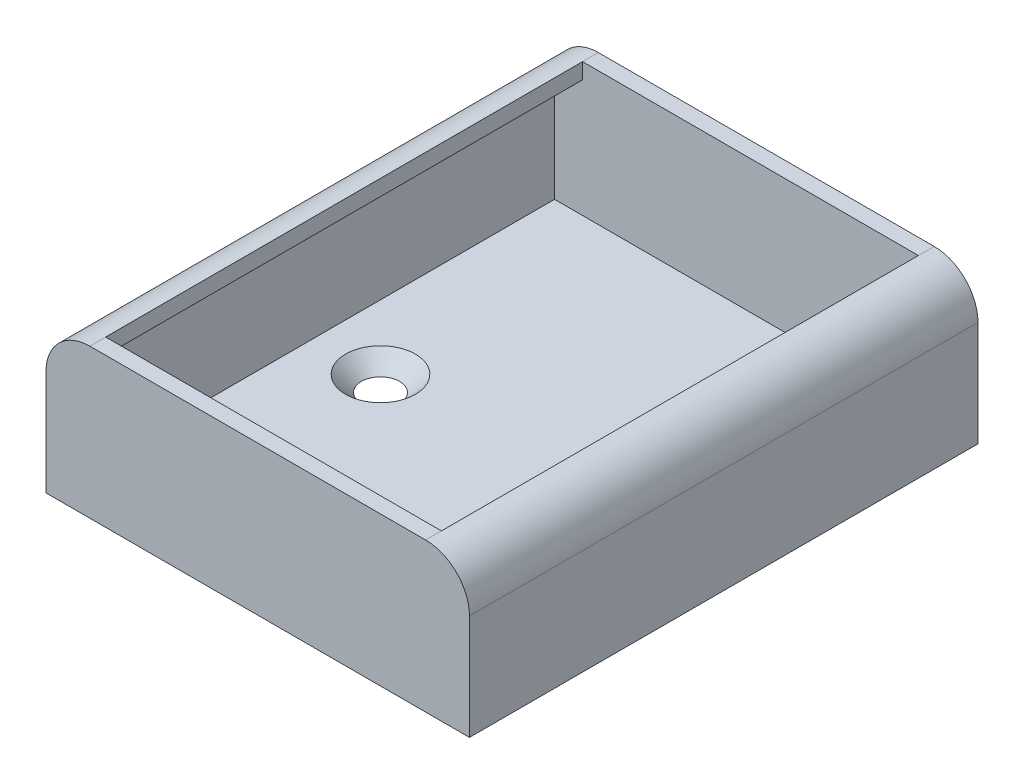
ISO-10303-21;
HEADER;
FILE_DESCRIPTION(('STEP AP214'),'2;1');
FILE_NAME('part.step','',(''),(''),'','','');
FILE_SCHEMA(('AUTOMOTIVE_DESIGN { 1 0 10303 214 1 1 1 1 }'));
ENDSEC;
DATA;
#1=APPLICATION_CONTEXT('core data for automotive mechanical design processes');
#2=APPLICATION_PROTOCOL_DEFINITION('international standard','automotive_design',2000,#1);
#3=PRODUCT_CONTEXT('',#1,'mechanical');
#4=PRODUCT('Part','Part','',(#3));
#5=PRODUCT_RELATED_PRODUCT_CATEGORY('part','',(#4));
#6=PRODUCT_DEFINITION_FORMATION('','',#4);
#7=PRODUCT_DEFINITION_CONTEXT('part definition',#1,'design');
#8=PRODUCT_DEFINITION('design','',#6,#7);
#9=PRODUCT_DEFINITION_SHAPE('','',#8);
#10=(LENGTH_UNIT() NAMED_UNIT(*) SI_UNIT(.MILLI.,.METRE.));
#11=(NAMED_UNIT(*) PLANE_ANGLE_UNIT() SI_UNIT($,.RADIAN.));
#12=(NAMED_UNIT(*) SI_UNIT($,.STERADIAN.) SOLID_ANGLE_UNIT());
#13=UNCERTAINTY_MEASURE_WITH_UNIT(LENGTH_MEASURE(1.E-05),#10,'distance_accuracy_value','');
#14=(GEOMETRIC_REPRESENTATION_CONTEXT(3) GLOBAL_UNCERTAINTY_ASSIGNED_CONTEXT((#13)) GLOBAL_UNIT_ASSIGNED_CONTEXT((#10,
#11,#12)) REPRESENTATION_CONTEXT('',''));
#15=CARTESIAN_POINT('',(0.,0.,0.));
#16=DIRECTION('',(0.,0.,1.));
#17=DIRECTION('',(1.,0.,0.));
#18=AXIS2_PLACEMENT_3D('',#15,#16,#17);
#19=CARTESIAN_POINT('',(0.,17.,0.));
#20=DIRECTION('',(0.,-1.,0.));
#21=DIRECTION('',(0.,0.,-1.));
#22=AXIS2_PLACEMENT_3D('',#19,#20,#21);
#23=PLANE('',#22);
#24=DIRECTION('',(-1.,0.,0.));
#25=VECTOR('',#24,1.);
#26=CARTESIAN_POINT('',(0.,17.,-27.2));
#27=LINE('',#26,#25);
#28=CARTESIAN_POINT('',(19.15,17.,-27.2));
#29=VERTEX_POINT('',#28);
#30=CARTESIAN_POINT('',(-19.15,17.,-27.2));
#31=VERTEX_POINT('',#30);
#32=EDGE_CURVE('E191',#29,#31,#27,.T.);
#33=ORIENTED_EDGE('',*,*,#32,.F.);
#34=DIRECTION('',(0.,0.,-1.));
#35=VECTOR('',#34,1.);
#36=CARTESIAN_POINT('',(19.15,17.,0.));
#37=LINE('',#36,#35);
#38=CARTESIAN_POINT('',(19.15,17.,-29.));
#39=VERTEX_POINT('',#38);
#40=EDGE_CURVE('E238',#29,#39,#37,.T.);
#41=ORIENTED_EDGE('',*,*,#40,.T.);
#42=DIRECTION('',(-1.,0.,0.));
#43=VECTOR('',#42,1.);
#44=CARTESIAN_POINT('',(-24.15,17.,-29.));
#45=LINE('',#44,#43);
#46=CARTESIAN_POINT('',(-19.15,17.,-29.));
#47=VERTEX_POINT('',#46);
#48=EDGE_CURVE('E214',#39,#47,#45,.T.);
#49=ORIENTED_EDGE('',*,*,#48,.T.);
#50=DIRECTION('',(0.,0.,1.));
#51=VECTOR('',#50,1.);
#52=CARTESIAN_POINT('',(-19.15,17.,0.));
#53=LINE('',#52,#51);
#54=EDGE_CURVE('E243',#47,#31,#53,.T.);
#55=ORIENTED_EDGE('',*,*,#54,.T.);
#56=EDGE_LOOP('',(#33,#41,#49,#55));
#57=FACE_BOUND('',#56,.T.);
#58=ADVANCED_FACE('F41',(#57),#23,.F.);
#59=DIRECTION('',(1.,0.,0.));
#60=VECTOR('',#59,1.);
#61=CARTESIAN_POINT('',(0.,17.,27.2));
#62=LINE('',#61,#60);
#63=CARTESIAN_POINT('',(-19.15,17.,27.2));
#64=VERTEX_POINT('',#63);
#65=CARTESIAN_POINT('',(19.15,17.,27.2));
#66=VERTEX_POINT('',#65);
#67=EDGE_CURVE('E204',#64,#66,#62,.T.);
#68=ORIENTED_EDGE('',*,*,#67,.F.);
#69=CARTESIAN_POINT('',(-19.15,17.,29.));
#70=VERTEX_POINT('',#69);
#71=EDGE_CURVE('E241',#64,#70,#53,.T.);
#72=ORIENTED_EDGE('',*,*,#71,.T.);
#73=DIRECTION('',(1.,0.,0.));
#74=VECTOR('',#73,1.);
#75=CARTESIAN_POINT('',(-24.15,17.,29.));
#76=LINE('',#75,#74);
#77=CARTESIAN_POINT('',(19.15,17.,29.));
#78=VERTEX_POINT('',#77);
#79=EDGE_CURVE('E217',#70,#78,#76,.T.);
#80=ORIENTED_EDGE('',*,*,#79,.T.);
#81=EDGE_CURVE('E242',#78,#66,#37,.T.);
#82=ORIENTED_EDGE('',*,*,#81,.T.);
#83=EDGE_LOOP('',(#68,#72,#80,#82));
#84=FACE_BOUND('',#83,.T.);
#85=ADVANCED_FACE('F308',(#84),#23,.F.);
#86=CARTESIAN_POINT('',(24.15,17.,29.));
#87=DIRECTION('',(-1.,0.,0.));
#88=DIRECTION('',(0.,0.,1.));
#89=AXIS2_PLACEMENT_3D('',#86,#87,#88);
#90=PLANE('',#89);
#91=DIRECTION('',(0.,-1.,0.));
#92=VECTOR('',#91,1.);
#93=CARTESIAN_POINT('',(24.15,17.,-29.));
#94=LINE('',#93,#92);
#95=CARTESIAN_POINT('',(24.15,12.,-29.));
#96=VERTEX_POINT('',#95);
#97=CARTESIAN_POINT('',(24.15,0.,-29.));
#98=VERTEX_POINT('',#97);
#99=EDGE_CURVE('E236',#96,#98,#94,.T.);
#100=ORIENTED_EDGE('',*,*,#99,.F.);
#101=DIRECTION('',(0.,0.,-1.));
#102=VECTOR('',#101,1.);
#103=CARTESIAN_POINT('',(24.15,12.,29.));
#104=LINE('',#103,#102);
#105=CARTESIAN_POINT('',(24.15,12.,29.));
#106=VERTEX_POINT('',#105);
#107=EDGE_CURVE('E260',#96,#106,#104,.F.);
#108=ORIENTED_EDGE('',*,*,#107,.T.);
#109=DIRECTION('',(0.,-1.,0.));
#110=VECTOR('',#109,1.);
#111=CARTESIAN_POINT('',(24.15,17.,29.));
#112=LINE('',#111,#110);
#113=CARTESIAN_POINT('',(24.15,0.,29.));
#114=VERTEX_POINT('',#113);
#115=EDGE_CURVE('E225',#106,#114,#112,.T.);
#116=ORIENTED_EDGE('',*,*,#115,.T.);
#117=DIRECTION('',(0.,0.,-1.));
#118=VECTOR('',#117,1.);
#119=CARTESIAN_POINT('',(24.15,0.,29.));
#120=LINE('',#119,#118);
#121=EDGE_CURVE('E210',#114,#98,#120,.T.);
#122=ORIENTED_EDGE('',*,*,#121,.T.);
#123=EDGE_LOOP('',(#100,#108,#116,#122));
#124=FACE_BOUND('',#123,.T.);
#125=ADVANCED_FACE('F283',(#124),#90,.F.);
#126=CARTESIAN_POINT('',(-24.15,17.,-29.));
#127=DIRECTION('',(0.,0.,1.));
#128=DIRECTION('',(1.,0.,0.));
#129=AXIS2_PLACEMENT_3D('',#126,#127,#128);
#130=PLANE('',#129);
#131=DIRECTION('',(0.,-1.,0.));
#132=VECTOR('',#131,1.);
#133=CARTESIAN_POINT('',(-24.15,17.,-29.));
#134=LINE('',#133,#132);
#135=CARTESIAN_POINT('',(-24.15,12.,-29.));
#136=VERTEX_POINT('',#135);
#137=CARTESIAN_POINT('',(-24.15,0.,-29.));
#138=VERTEX_POINT('',#137);
#139=EDGE_CURVE('E237',#136,#138,#134,.T.);
#140=ORIENTED_EDGE('',*,*,#139,.F.);
#141=CARTESIAN_POINT('',(-19.15,12.,-29.));
#142=DIRECTION('',(0.,0.,1.));
#143=DIRECTION('',(1.,0.,0.));
#144=AXIS2_PLACEMENT_3D('',#141,#142,#143);
#145=CIRCLE('',#144,5.);
#146=EDGE_CURVE('E254',#136,#47,#145,.F.);
#147=ORIENTED_EDGE('',*,*,#146,.T.);
#148=ORIENTED_EDGE('',*,*,#48,.F.);
#149=CARTESIAN_POINT('',(19.15,12.,-29.));
#150=DIRECTION('',(0.,0.,1.));
#151=DIRECTION('',(1.,0.,0.));
#152=AXIS2_PLACEMENT_3D('',#149,#150,#151);
#153=CIRCLE('',#152,5.);
#154=EDGE_CURVE('E63',#39,#96,#153,.F.);
#155=ORIENTED_EDGE('',*,*,#154,.T.);
#156=ORIENTED_EDGE('',*,*,#99,.T.);
#157=DIRECTION('',(-1.,0.,0.));
#158=VECTOR('',#157,1.);
#159=CARTESIAN_POINT('',(-24.15,0.,-29.));
#160=LINE('',#159,#158);
#161=EDGE_CURVE('E223',#98,#138,#160,.T.);
#162=ORIENTED_EDGE('',*,*,#161,.T.);
#163=EDGE_LOOP('',(#140,#147,#148,#155,#156,#162));
#164=FACE_BOUND('',#163,.T.);
#165=ADVANCED_FACE('F300',(#164),#130,.F.);
#166=CARTESIAN_POINT('',(-24.15,17.,29.));
#167=DIRECTION('',(1.,0.,0.));
#168=DIRECTION('',(0.,0.,-1.));
#169=AXIS2_PLACEMENT_3D('',#166,#167,#168);
#170=PLANE('',#169);
#171=DIRECTION('',(0.,-1.,0.));
#172=VECTOR('',#171,1.);
#173=CARTESIAN_POINT('',(-24.15,17.,29.));
#174=LINE('',#173,#172);
#175=CARTESIAN_POINT('',(-24.15,12.,29.));
#176=VERTEX_POINT('',#175);
#177=CARTESIAN_POINT('',(-24.15,0.,29.));
#178=VERTEX_POINT('',#177);
#179=EDGE_CURVE('E232',#176,#178,#174,.T.);
#180=ORIENTED_EDGE('',*,*,#179,.F.);
#181=DIRECTION('',(0.,0.,1.));
#182=VECTOR('',#181,1.);
#183=CARTESIAN_POINT('',(-24.15,12.,29.));
#184=LINE('',#183,#182);
#185=EDGE_CURVE('E252',#176,#136,#184,.F.);
#186=ORIENTED_EDGE('',*,*,#185,.T.);
#187=ORIENTED_EDGE('',*,*,#139,.T.);
#188=DIRECTION('',(0.,0.,1.));
#189=VECTOR('',#188,1.);
#190=CARTESIAN_POINT('',(-24.15,0.,29.));
#191=LINE('',#190,#189);
#192=EDGE_CURVE('E230',#138,#178,#191,.T.);
#193=ORIENTED_EDGE('',*,*,#192,.T.);
#194=EDGE_LOOP('',(#180,#186,#187,#193));
#195=FACE_BOUND('',#194,.T.);
#196=ADVANCED_FACE('F293',(#195),#170,.F.);
#197=CARTESIAN_POINT('',(-24.15,17.,29.));
#198=DIRECTION('',(0.,0.,-1.));
#199=DIRECTION('',(-1.,0.,0.));
#200=AXIS2_PLACEMENT_3D('',#197,#198,#199);
#201=PLANE('',#200);
#202=ORIENTED_EDGE('',*,*,#79,.F.);
#203=CARTESIAN_POINT('',(-19.15,12.,29.));
#204=DIRECTION('',(0.,0.,-1.));
#205=DIRECTION('',(-1.,0.,0.));
#206=AXIS2_PLACEMENT_3D('',#203,#204,#205);
#207=CIRCLE('',#206,5.);
#208=EDGE_CURVE('E249',#70,#176,#207,.F.);
#209=ORIENTED_EDGE('',*,*,#208,.T.);
#210=ORIENTED_EDGE('',*,*,#179,.T.);
#211=DIRECTION('',(1.,0.,0.));
#212=VECTOR('',#211,1.);
#213=CARTESIAN_POINT('',(-24.15,0.,29.));
#214=LINE('',#213,#212);
#215=EDGE_CURVE('E218',#178,#114,#214,.T.);
#216=ORIENTED_EDGE('',*,*,#215,.T.);
#217=ORIENTED_EDGE('',*,*,#115,.F.);
#218=CARTESIAN_POINT('',(19.15,12.,29.));
#219=DIRECTION('',(0.,0.,-1.));
#220=DIRECTION('',(-1.,0.,0.));
#221=AXIS2_PLACEMENT_3D('',#218,#219,#220);
#222=CIRCLE('',#221,5.);
#223=EDGE_CURVE('E248',#106,#78,#222,.F.);
#224=ORIENTED_EDGE('',*,*,#223,.T.);
#225=EDGE_LOOP('',(#202,#209,#210,#216,#217,#224));
#226=FACE_BOUND('',#225,.T.);
#227=ADVANCED_FACE('F280',(#226),#201,.F.);
#228=CARTESIAN_POINT('',(0.,0.,0.));
#229=DIRECTION('',(0.,-1.,0.));
#230=DIRECTION('',(0.,0.,-1.));
#231=AXIS2_PLACEMENT_3D('',#228,#229,#230);
#232=PLANE('',#231);
#233=CARTESIAN_POINT('',(-15.,0.,0.));
#234=DIRECTION('',(0.,-1.,0.));
#235=DIRECTION('',(0.,0.,-1.));
#236=AXIS2_PLACEMENT_3D('',#233,#234,#235);
#237=CIRCLE('',#236,2.18000000000003);
#238=CARTESIAN_POINT('',(-15.,0.,-2.18000000000003));
#239=VERTEX_POINT('',#238);
#240=EDGE_CURVE('E265',#239,#239,#237,.F.);
#241=ORIENTED_EDGE('',*,*,#240,.T.);
#242=EDGE_LOOP('',(#241));
#243=FACE_BOUND('',#242,.T.);
#244=CARTESIAN_POINT('',(15.,0.,0.));
#245=DIRECTION('',(0.,-1.,0.));
#246=DIRECTION('',(0.,0.,-1.));
#247=AXIS2_PLACEMENT_3D('',#244,#245,#246);
#248=CIRCLE('',#247,2.18000000000003);
#249=CARTESIAN_POINT('',(15.,0.,-2.18000000000003));
#250=VERTEX_POINT('',#249);
#251=EDGE_CURVE('E259',#250,#250,#248,.F.);
#252=ORIENTED_EDGE('',*,*,#251,.T.);
#253=EDGE_LOOP('',(#252));
#254=FACE_BOUND('',#253,.T.);
#255=ORIENTED_EDGE('',*,*,#121,.F.);
#256=ORIENTED_EDGE('',*,*,#215,.F.);
#257=ORIENTED_EDGE('',*,*,#192,.F.);
#258=ORIENTED_EDGE('',*,*,#161,.F.);
#259=EDGE_LOOP('',(#255,#256,#257,#258));
#260=FACE_BOUND('',#259,.T.);
#261=ADVANCED_FACE('F272',(#243,#254,#260),#232,.T.);
#262=CARTESIAN_POINT('',(-19.15,12.,0.));
#263=DIRECTION('',(0.,0.,1.));
#264=DIRECTION('',(1.,0.,0.));
#265=AXIS2_PLACEMENT_3D('',#262,#263,#264);
#266=CYLINDRICAL_SURFACE('',#265,5.);
#267=ORIENTED_EDGE('',*,*,#146,.F.);
#268=ORIENTED_EDGE('',*,*,#185,.F.);
#269=ORIENTED_EDGE('',*,*,#208,.F.);
#270=ORIENTED_EDGE('',*,*,#71,.F.);
#271=DIRECTION('',(0.,0.,1.));
#272=VECTOR('',#271,1.);
#273=CARTESIAN_POINT('',(-19.15,17.,0.));
#274=LINE('',#273,#272);
#275=EDGE_CURVE('E192',#31,#64,#274,.T.);
#276=ORIENTED_EDGE('',*,*,#275,.F.);
#277=ORIENTED_EDGE('',*,*,#54,.F.);
#278=EDGE_LOOP('',(#267,#268,#269,#270,#276,#277));
#279=FACE_BOUND('',#278,.T.);
#280=ADVANCED_FACE('F277',(#279),#266,.T.);
#281=CARTESIAN_POINT('',(19.15,12.,0.));
#282=DIRECTION('',(0.,0.,-1.));
#283=DIRECTION('',(-1.,0.,0.));
#284=AXIS2_PLACEMENT_3D('',#281,#282,#283);
#285=CYLINDRICAL_SURFACE('',#284,5.);
#286=ORIENTED_EDGE('',*,*,#223,.F.);
#287=ORIENTED_EDGE('',*,*,#107,.F.);
#288=ORIENTED_EDGE('',*,*,#154,.F.);
#289=ORIENTED_EDGE('',*,*,#40,.F.);
#290=DIRECTION('',(0.,0.,-1.));
#291=VECTOR('',#290,1.);
#292=CARTESIAN_POINT('',(19.15,17.,0.));
#293=LINE('',#292,#291);
#294=EDGE_CURVE('E152',#66,#29,#293,.T.);
#295=ORIENTED_EDGE('',*,*,#294,.F.);
#296=ORIENTED_EDGE('',*,*,#81,.F.);
#297=EDGE_LOOP('',(#286,#287,#288,#289,#295,#296));
#298=FACE_BOUND('',#297,.T.);
#299=ADVANCED_FACE('F355',(#298),#285,.T.);
#300=CARTESIAN_POINT('',(19.15,17.,0.));
#301=DIRECTION('',(-1.,0.,0.));
#302=DIRECTION('',(0.,0.,-1.));
#303=AXIS2_PLACEMENT_3D('',#300,#301,#302);
#304=PLANE('',#303);
#305=ORIENTED_EDGE('',*,*,#294,.T.);
#306=DIRECTION('',(0.,1.,0.));
#307=VECTOR('',#306,1.);
#308=CARTESIAN_POINT('',(19.15,17.,-27.2));
#309=LINE('',#308,#307);
#310=CARTESIAN_POINT('',(19.15,15.2,-27.2));
#311=VERTEX_POINT('',#310);
#312=EDGE_CURVE('E196',#311,#29,#309,.T.);
#313=ORIENTED_EDGE('',*,*,#312,.F.);
#314=DIRECTION('',(0.,0.,-1.));
#315=VECTOR('',#314,1.);
#316=CARTESIAN_POINT('',(19.15,15.2,0.));
#317=LINE('',#316,#315);
#318=CARTESIAN_POINT('',(19.15,15.2,27.2));
#319=VERTEX_POINT('',#318);
#320=EDGE_CURVE('E201',#319,#311,#317,.T.);
#321=ORIENTED_EDGE('',*,*,#320,.F.);
#322=DIRECTION('',(0.,-1.,0.));
#323=VECTOR('',#322,1.);
#324=CARTESIAN_POINT('',(19.15,17.,27.2));
#325=LINE('',#324,#323);
#326=EDGE_CURVE('E60',#319,#66,#325,.F.);
#327=ORIENTED_EDGE('',*,*,#326,.T.);
#328=EDGE_LOOP('',(#305,#313,#321,#327));
#329=FACE_BOUND('',#328,.T.);
#330=ADVANCED_FACE('F362',(#329),#304,.T.);
#331=CARTESIAN_POINT('',(-19.15,17.,0.));
#332=DIRECTION('',(1.,0.,0.));
#333=DIRECTION('',(0.,0.,1.));
#334=AXIS2_PLACEMENT_3D('',#331,#332,#333);
#335=PLANE('',#334);
#336=ORIENTED_EDGE('',*,*,#275,.T.);
#337=DIRECTION('',(0.,1.,0.));
#338=VECTOR('',#337,1.);
#339=CARTESIAN_POINT('',(-19.15,17.,27.2));
#340=LINE('',#339,#338);
#341=CARTESIAN_POINT('',(-19.15,15.2,27.2));
#342=VERTEX_POINT('',#341);
#343=EDGE_CURVE('E200',#342,#64,#340,.T.);
#344=ORIENTED_EDGE('',*,*,#343,.F.);
#345=DIRECTION('',(0.,0.,1.));
#346=VECTOR('',#345,1.);
#347=CARTESIAN_POINT('',(-19.15,15.2,0.));
#348=LINE('',#347,#346);
#349=CARTESIAN_POINT('',(-19.15,15.2,-27.2));
#350=VERTEX_POINT('',#349);
#351=EDGE_CURVE('E199',#350,#342,#348,.T.);
#352=ORIENTED_EDGE('',*,*,#351,.F.);
#353=DIRECTION('',(0.,-1.,0.));
#354=VECTOR('',#353,1.);
#355=CARTESIAN_POINT('',(-19.15,17.,-27.2));
#356=LINE('',#355,#354);
#357=EDGE_CURVE('E194',#350,#31,#356,.F.);
#358=ORIENTED_EDGE('',*,*,#357,.T.);
#359=EDGE_LOOP('',(#336,#344,#352,#358));
#360=FACE_BOUND('',#359,.T.);
#361=ADVANCED_FACE('F381',(#360),#335,.T.);
#362=CARTESIAN_POINT('',(22.35,17.,29.));
#363=DIRECTION('',(-1.,0.,0.));
#364=DIRECTION('',(0.,0.,1.));
#365=AXIS2_PLACEMENT_3D('',#362,#363,#364);
#366=PLANE('',#365);
#367=DIRECTION('',(0.,-1.,0.));
#368=VECTOR('',#367,1.);
#369=CARTESIAN_POINT('',(22.35,17.,-27.2));
#370=LINE('',#369,#368);
#371=CARTESIAN_POINT('',(22.35,12.,-27.2));
#372=VERTEX_POINT('',#371);
#373=CARTESIAN_POINT('',(22.35,1.8,-27.2));
#374=VERTEX_POINT('',#373);
#375=EDGE_CURVE('E144',#372,#374,#370,.T.);
#376=ORIENTED_EDGE('',*,*,#375,.T.);
#377=DIRECTION('',(0.,0.,-1.));
#378=VECTOR('',#377,1.);
#379=CARTESIAN_POINT('',(22.35,1.8,0.));
#380=LINE('',#379,#378);
#381=CARTESIAN_POINT('',(22.35,1.8,27.2));
#382=VERTEX_POINT('',#381);
#383=EDGE_CURVE('E147',#382,#374,#380,.T.);
#384=ORIENTED_EDGE('',*,*,#383,.F.);
#385=DIRECTION('',(0.,-1.,0.));
#386=VECTOR('',#385,1.);
#387=CARTESIAN_POINT('',(22.35,17.,27.2));
#388=LINE('',#387,#386);
#389=CARTESIAN_POINT('',(22.35,12.,27.2));
#390=VERTEX_POINT('',#389);
#391=EDGE_CURVE('E171',#390,#382,#388,.T.);
#392=ORIENTED_EDGE('',*,*,#391,.F.);
#393=DIRECTION('',(0.,0.,1.));
#394=VECTOR('',#393,1.);
#395=CARTESIAN_POINT('',(22.35,12.,29.));
#396=LINE('',#395,#394);
#397=EDGE_CURVE('E151',#372,#390,#396,.T.);
#398=ORIENTED_EDGE('',*,*,#397,.F.);
#399=EDGE_LOOP('',(#376,#384,#392,#398));
#400=FACE_BOUND('',#399,.T.);
#401=ADVANCED_FACE('F150',(#400),#366,.T.);
#402=CARTESIAN_POINT('',(-24.15,17.,-27.2));
#403=DIRECTION('',(0.,0.,1.));
#404=DIRECTION('',(1.,0.,0.));
#405=AXIS2_PLACEMENT_3D('',#402,#403,#404);
#406=PLANE('',#405);
#407=DIRECTION('',(0.,-1.,0.));
#408=VECTOR('',#407,1.);
#409=CARTESIAN_POINT('',(-22.35,17.,-27.2));
#410=LINE('',#409,#408);
#411=CARTESIAN_POINT('',(-22.35,12.,-27.2));
#412=VERTEX_POINT('',#411);
#413=CARTESIAN_POINT('',(-22.35,1.8,-27.2));
#414=VERTEX_POINT('',#413);
#415=EDGE_CURVE('E154',#412,#414,#410,.T.);
#416=ORIENTED_EDGE('',*,*,#415,.T.);
#417=DIRECTION('',(-1.,0.,0.));
#418=VECTOR('',#417,1.);
#419=CARTESIAN_POINT('',(0.,1.8,-27.2));
#420=LINE('',#419,#418);
#421=EDGE_CURVE('E158',#374,#414,#420,.T.);
#422=ORIENTED_EDGE('',*,*,#421,.F.);
#423=ORIENTED_EDGE('',*,*,#375,.F.);
#424=CARTESIAN_POINT('',(19.15,12.,-27.2));
#425=DIRECTION('',(0.,0.,1.));
#426=DIRECTION('',(1.,0.,0.));
#427=AXIS2_PLACEMENT_3D('',#424,#425,#426);
#428=CIRCLE('',#427,3.2);
#429=EDGE_CURVE('E182',#311,#372,#428,.F.);
#430=ORIENTED_EDGE('',*,*,#429,.F.);
#431=ORIENTED_EDGE('',*,*,#312,.T.);
#432=ORIENTED_EDGE('',*,*,#32,.T.);
#433=ORIENTED_EDGE('',*,*,#357,.F.);
#434=CARTESIAN_POINT('',(-19.15,12.,-27.2));
#435=DIRECTION('',(0.,0.,1.));
#436=DIRECTION('',(1.,0.,0.));
#437=AXIS2_PLACEMENT_3D('',#434,#435,#436);
#438=CIRCLE('',#437,3.2);
#439=EDGE_CURVE('E178',#412,#350,#438,.F.);
#440=ORIENTED_EDGE('',*,*,#439,.F.);
#441=EDGE_LOOP('',(#416,#422,#423,#430,#431,#432,#433,#440));
#442=FACE_BOUND('',#441,.T.);
#443=ADVANCED_FACE('F157',(#442),#406,.T.);
#444=CARTESIAN_POINT('',(-22.35,17.,29.));
#445=DIRECTION('',(1.,0.,0.));
#446=DIRECTION('',(0.,0.,-1.));
#447=AXIS2_PLACEMENT_3D('',#444,#445,#446);
#448=PLANE('',#447);
#449=DIRECTION('',(0.,-1.,0.));
#450=VECTOR('',#449,1.);
#451=CARTESIAN_POINT('',(-22.35,17.,27.2));
#452=LINE('',#451,#450);
#453=CARTESIAN_POINT('',(-22.35,12.,27.2));
#454=VERTEX_POINT('',#453);
#455=CARTESIAN_POINT('',(-22.35,1.8,27.2));
#456=VERTEX_POINT('',#455);
#457=EDGE_CURVE('E180',#454,#456,#452,.T.);
#458=ORIENTED_EDGE('',*,*,#457,.T.);
#459=DIRECTION('',(0.,0.,1.));
#460=VECTOR('',#459,1.);
#461=CARTESIAN_POINT('',(-22.35,1.8,0.));
#462=LINE('',#461,#460);
#463=EDGE_CURVE('E164',#414,#456,#462,.T.);
#464=ORIENTED_EDGE('',*,*,#463,.F.);
#465=ORIENTED_EDGE('',*,*,#415,.F.);
#466=DIRECTION('',(0.,0.,-1.));
#467=VECTOR('',#466,1.);
#468=CARTESIAN_POINT('',(-22.35,12.,29.));
#469=LINE('',#468,#467);
#470=EDGE_CURVE('E185',#454,#412,#469,.T.);
#471=ORIENTED_EDGE('',*,*,#470,.F.);
#472=EDGE_LOOP('',(#458,#464,#465,#471));
#473=FACE_BOUND('',#472,.T.);
#474=ADVANCED_FACE('F386',(#473),#448,.T.);
#475=CARTESIAN_POINT('',(-24.15,17.,27.2));
#476=DIRECTION('',(0.,0.,-1.));
#477=DIRECTION('',(-1.,0.,0.));
#478=AXIS2_PLACEMENT_3D('',#475,#476,#477);
#479=PLANE('',#478);
#480=ORIENTED_EDGE('',*,*,#67,.T.);
#481=ORIENTED_EDGE('',*,*,#326,.F.);
#482=CARTESIAN_POINT('',(19.15,12.,27.2));
#483=DIRECTION('',(0.,0.,-1.));
#484=DIRECTION('',(-1.,0.,0.));
#485=AXIS2_PLACEMENT_3D('',#482,#483,#484);
#486=CIRCLE('',#485,3.2);
#487=EDGE_CURVE('E186',#390,#319,#486,.F.);
#488=ORIENTED_EDGE('',*,*,#487,.F.);
#489=ORIENTED_EDGE('',*,*,#391,.T.);
#490=DIRECTION('',(1.,0.,0.));
#491=VECTOR('',#490,1.);
#492=CARTESIAN_POINT('',(0.,1.8,27.2));
#493=LINE('',#492,#491);
#494=EDGE_CURVE('E168',#456,#382,#493,.T.);
#495=ORIENTED_EDGE('',*,*,#494,.F.);
#496=ORIENTED_EDGE('',*,*,#457,.F.);
#497=CARTESIAN_POINT('',(-19.15,12.,27.2));
#498=DIRECTION('',(0.,0.,-1.));
#499=DIRECTION('',(-1.,0.,0.));
#500=AXIS2_PLACEMENT_3D('',#497,#498,#499);
#501=CIRCLE('',#500,3.2);
#502=EDGE_CURVE('E187',#342,#454,#501,.F.);
#503=ORIENTED_EDGE('',*,*,#502,.F.);
#504=ORIENTED_EDGE('',*,*,#343,.T.);
#505=EDGE_LOOP('',(#480,#481,#488,#489,#495,#496,#503,#504));
#506=FACE_BOUND('',#505,.T.);
#507=ADVANCED_FACE('F400',(#506),#479,.T.);
#508=CARTESIAN_POINT('',(0.,1.8,0.));
#509=DIRECTION('',(0.,-1.,0.));
#510=DIRECTION('',(0.,0.,-1.));
#511=AXIS2_PLACEMENT_3D('',#508,#509,#510);
#512=PLANE('',#511);
#513=CARTESIAN_POINT('',(-15.,1.8,0.));
#514=DIRECTION('',(0.,-1.,0.));
#515=DIRECTION('',(0.,0.,-1.));
#516=AXIS2_PLACEMENT_3D('',#513,#514,#515);
#517=CIRCLE('',#516,3.98000000000002);
#518=CARTESIAN_POINT('',(-15.,1.8,-3.98000000000002));
#519=VERTEX_POINT('',#518);
#520=EDGE_CURVE('E11',#519,#519,#517,.T.);
#521=ORIENTED_EDGE('',*,*,#520,.T.);
#522=EDGE_LOOP('',(#521));
#523=FACE_BOUND('',#522,.T.);
#524=CARTESIAN_POINT('',(15.,1.8,0.));
#525=DIRECTION('',(0.,-1.,0.));
#526=DIRECTION('',(0.,0.,-1.));
#527=AXIS2_PLACEMENT_3D('',#524,#525,#526);
#528=CIRCLE('',#527,3.98000000000002);
#529=CARTESIAN_POINT('',(15.,1.8,-3.98000000000002));
#530=VERTEX_POINT('',#529);
#531=EDGE_CURVE('E49',#530,#530,#528,.T.);
#532=ORIENTED_EDGE('',*,*,#531,.T.);
#533=EDGE_LOOP('',(#532));
#534=FACE_BOUND('',#533,.T.);
#535=ORIENTED_EDGE('',*,*,#383,.T.);
#536=ORIENTED_EDGE('',*,*,#421,.T.);
#537=ORIENTED_EDGE('',*,*,#463,.T.);
#538=ORIENTED_EDGE('',*,*,#494,.T.);
#539=EDGE_LOOP('',(#535,#536,#537,#538));
#540=FACE_BOUND('',#539,.T.);
#541=ADVANCED_FACE('F169',(#523,#534,#540),#512,.F.);
#542=CARTESIAN_POINT('',(-19.15,12.,0.));
#543=DIRECTION('',(0.,0.,1.));
#544=DIRECTION('',(1.,0.,0.));
#545=AXIS2_PLACEMENT_3D('',#542,#543,#544);
#546=CYLINDRICAL_SURFACE('',#545,3.2);
#547=ORIENTED_EDGE('',*,*,#439,.T.);
#548=ORIENTED_EDGE('',*,*,#351,.T.);
#549=ORIENTED_EDGE('',*,*,#502,.T.);
#550=ORIENTED_EDGE('',*,*,#470,.T.);
#551=EDGE_LOOP('',(#547,#548,#549,#550));
#552=FACE_BOUND('',#551,.T.);
#553=ADVANCED_FACE('F412',(#552),#546,.F.);
#554=CARTESIAN_POINT('',(19.15,12.,0.));
#555=DIRECTION('',(0.,0.,-1.));
#556=DIRECTION('',(-1.,0.,0.));
#557=AXIS2_PLACEMENT_3D('',#554,#555,#556);
#558=CYLINDRICAL_SURFACE('',#557,3.2);
#559=ORIENTED_EDGE('',*,*,#487,.T.);
#560=ORIENTED_EDGE('',*,*,#320,.T.);
#561=ORIENTED_EDGE('',*,*,#429,.T.);
#562=ORIENTED_EDGE('',*,*,#397,.T.);
#563=EDGE_LOOP('',(#559,#560,#561,#562));
#564=FACE_BOUND('',#563,.T.);
#565=ADVANCED_FACE('F318',(#564),#558,.F.);
#566=CARTESIAN_POINT('',(-15.,-0.430000000000038,0.));
#567=DIRECTION('',(0.,1.,0.));
#568=DIRECTION('',(0.,0.,1.));
#569=AXIS2_PLACEMENT_3D('',#566,#567,#568);
#570=CONICAL_SURFACE('',#569,1.75,0.785398163397443);
#571=ORIENTED_EDGE('',*,*,#520,.F.);
#572=EDGE_LOOP('',(#571));
#573=FACE_BOUND('',#572,.T.);
#574=ORIENTED_EDGE('',*,*,#240,.F.);
#575=EDGE_LOOP('',(#574));
#576=FACE_BOUND('',#575,.T.);
#577=ADVANCED_FACE('F269',(#573,#576),#570,.F.);
#578=CARTESIAN_POINT('',(15.,-0.430000000000038,0.));
#579=DIRECTION('',(0.,1.,0.));
#580=DIRECTION('',(0.,0.,1.));
#581=AXIS2_PLACEMENT_3D('',#578,#579,#580);
#582=CONICAL_SURFACE('',#581,1.75,0.785398163397443);
#583=ORIENTED_EDGE('',*,*,#531,.F.);
#584=EDGE_LOOP('',(#583));
#585=FACE_BOUND('',#584,.T.);
#586=ORIENTED_EDGE('',*,*,#251,.F.);
#587=EDGE_LOOP('',(#586));
#588=FACE_BOUND('',#587,.T.);
#589=ADVANCED_FACE('F42',(#585,#588),#582,.F.);
#590=CLOSED_SHELL('',(#58,#85,#125,#165,#196,#227,#261,#280,#299,#330,#361,#401,#443,#474,#507,
#541,#553,#565,#577,#589));
#591=MANIFOLD_SOLID_BREP('B2',#590);
#592=ADVANCED_BREP_SHAPE_REPRESENTATION('',(#18,#591),#14);
#593=SHAPE_DEFINITION_REPRESENTATION(#9,#592);
ENDSEC;
END-ISO-10303-21;
